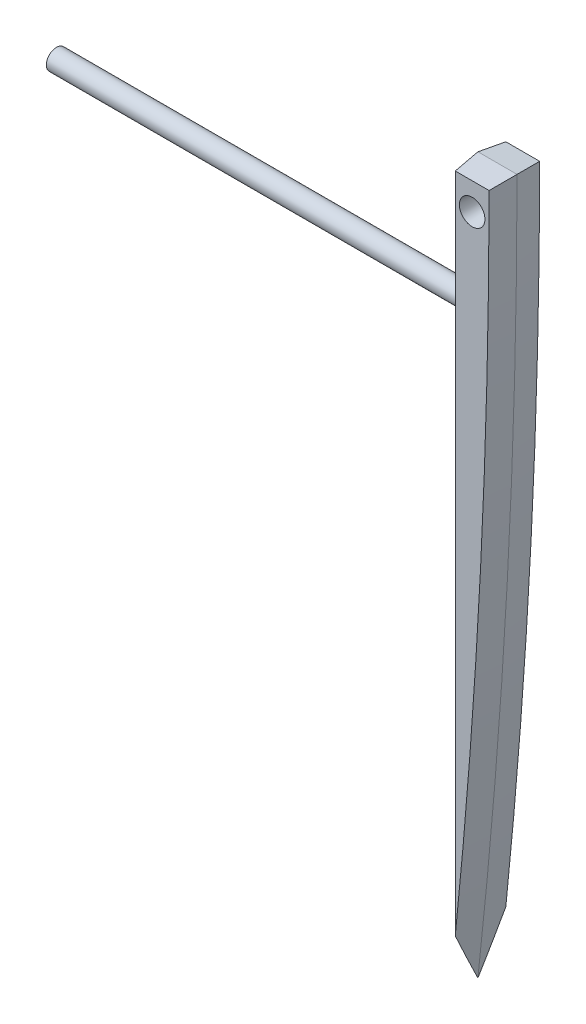
ISO-10303-21;
HEADER;
FILE_DESCRIPTION(('STEP AP214'),'2;1');
FILE_NAME('part.step','',(''),(''),'','','');
FILE_SCHEMA(('AUTOMOTIVE_DESIGN { 1 0 10303 214 1 1 1 1 }'));
ENDSEC;
DATA;
#1=APPLICATION_CONTEXT('core data for automotive mechanical design processes');
#2=APPLICATION_PROTOCOL_DEFINITION('international standard','automotive_design',2000,#1);
#3=PRODUCT_CONTEXT('',#1,'mechanical');
#4=PRODUCT('Part','Part','',(#3));
#5=PRODUCT_RELATED_PRODUCT_CATEGORY('part','',(#4));
#6=PRODUCT_DEFINITION_FORMATION('','',#4);
#7=PRODUCT_DEFINITION_CONTEXT('part definition',#1,'design');
#8=PRODUCT_DEFINITION('design','',#6,#7);
#9=PRODUCT_DEFINITION_SHAPE('','',#8);
#10=(LENGTH_UNIT() NAMED_UNIT(*) SI_UNIT(.MILLI.,.METRE.));
#11=(NAMED_UNIT(*) PLANE_ANGLE_UNIT() SI_UNIT($,.RADIAN.));
#12=(NAMED_UNIT(*) SI_UNIT($,.STERADIAN.) SOLID_ANGLE_UNIT());
#13=UNCERTAINTY_MEASURE_WITH_UNIT(LENGTH_MEASURE(1.E-05),#10,'distance_accuracy_value','');
#14=(GEOMETRIC_REPRESENTATION_CONTEXT(3) GLOBAL_UNCERTAINTY_ASSIGNED_CONTEXT((#13)) GLOBAL_UNIT_ASSIGNED_CONTEXT((#10,
#11,#12)) REPRESENTATION_CONTEXT('',''));
#15=CARTESIAN_POINT('',(0.,0.,0.));
#16=DIRECTION('',(0.,0.,1.));
#17=DIRECTION('',(1.,0.,0.));
#18=AXIS2_PLACEMENT_3D('',#15,#16,#17);
#19=CARTESIAN_POINT('',(-41.6483855846604,24.230814719516,0.));
#20=DIRECTION('',(1.,0.,0.));
#21=DIRECTION('',(0.,0.,-1.));
#22=AXIS2_PLACEMENT_3D('',#19,#20,#21);
#23=CYLINDRICAL_SURFACE('',#22,1.);
#24=CARTESIAN_POINT('',(-41.6483855846604,24.230814719516,0.));
#25=DIRECTION('',(1.,0.,0.));
#26=DIRECTION('',(0.,0.,-1.));
#27=AXIS2_PLACEMENT_3D('',#24,#25,#26);
#28=CIRCLE('',#27,1.);
#29=CARTESIAN_POINT('',(-41.6483855846604,24.230814719516,-1.));
#30=VERTEX_POINT('',#29);
#31=EDGE_CURVE('E11',#30,#30,#28,.T.);
#32=ORIENTED_EDGE('',*,*,#31,.T.);
#33=EDGE_LOOP('',(#32));
#34=FACE_BOUND('',#33,.T.);
#35=CARTESIAN_POINT('',(0.,24.230814719516,0.));
#36=DIRECTION('',(1.,0.,0.));
#37=DIRECTION('',(0.,0.,-1.));
#38=AXIS2_PLACEMENT_3D('',#35,#36,#37);
#39=CIRCLE('',#38,1.);
#40=CARTESIAN_POINT('',(0.,24.230814719516,-1.));
#41=VERTEX_POINT('',#40);
#42=EDGE_CURVE('E43',#41,#41,#39,.T.);
#43=ORIENTED_EDGE('',*,*,#42,.F.);
#44=EDGE_LOOP('',(#43));
#45=FACE_BOUND('',#44,.T.);
#46=ADVANCED_FACE('F40',(#34,#45),#23,.T.);
#47=CARTESIAN_POINT('',(-41.6483855846604,24.230814719516,0.));
#48=DIRECTION('',(1.,0.,0.));
#49=DIRECTION('',(0.,0.,-1.));
#50=AXIS2_PLACEMENT_3D('',#47,#48,#49);
#51=PLANE('',#50);
#52=ORIENTED_EDGE('',*,*,#31,.F.);
#53=EDGE_LOOP('',(#52));
#54=FACE_BOUND('',#53,.T.);
#55=ADVANCED_FACE('F55',(#54),#51,.F.);
#56=CARTESIAN_POINT('',(0.,24.230814719516,0.));
#57=DIRECTION('',(1.,0.,0.));
#58=DIRECTION('',(0.,0.,-1.));
#59=AXIS2_PLACEMENT_3D('',#56,#57,#58);
#60=PLANE('',#59);
#61=ORIENTED_EDGE('',*,*,#42,.T.);
#62=EDGE_LOOP('',(#61));
#63=FACE_BOUND('',#62,.T.);
#64=ADVANCED_FACE('F52',(#63),#60,.T.);
#65=CLOSED_SHELL('',(#46,#55,#64));
#66=MANIFOLD_SOLID_BREP('B2',#65);
#67=CARTESIAN_POINT('',(0.,37.1209387159533,0.));
#68=DIRECTION('',(-0.994521895368273,0.,-0.104528463267653));
#69=DIRECTION('',(-0.104528463267653,0.,0.994521895368273));
#70=AXIS2_PLACEMENT_3D('',#67,#68,#69);
#71=PLANE('',#70);
#72=DIRECTION('',(0.,-1.,0.));
#73=VECTOR('',#72,1.);
#74=CARTESIAN_POINT('',(0.,37.1209387159533,0.));
#75=LINE('',#74,#73);
#76=CARTESIAN_POINT('',(0.,37.1209387159533,0.));
#77=VERTEX_POINT('',#76);
#78=CARTESIAN_POINT('',(0.,-33.5856112191957,0.));
#79=VERTEX_POINT('',#78);
#80=EDGE_CURVE('E118',#77,#79,#75,.T.);
#81=ORIENTED_EDGE('',*,*,#80,.F.);
#82=DIRECTION('',(-0.103962051184498,0.103962051184498,0.989132844377854));
#83=VECTOR('',#82,1.);
#84=CARTESIAN_POINT('',(0.,37.1209387159533,0.));
#85=LINE('',#84,#83);
#86=CARTESIAN_POINT('',(0.262760588164191,36.8581781277891,-2.5));
#87=VERTEX_POINT('',#86);
#88=EDGE_CURVE('E38',#87,#77,#85,.T.);
#89=ORIENTED_EDGE('',*,*,#88,.F.);
#90=DIRECTION('',(0.,-1.,0.));
#91=VECTOR('',#90,1.);
#92=CARTESIAN_POINT('',(0.262760588164191,37.1209387159533,-2.5));
#93=LINE('',#92,#91);
#94=CARTESIAN_POINT('',(0.262760588164191,-28.6054599772317,-2.5));
#95=VERTEX_POINT('',#94);
#96=EDGE_CURVE('E146',#87,#95,#93,.T.);
#97=ORIENTED_EDGE('',*,*,#96,.T.);
#98=CARTESIAN_POINT('',(0.262760588164191,-28.6054599772317,-2.5));
#99=CARTESIAN_POINT('',(0.220241124288974,-29.4416370621499,-2.09545432429303));
#100=CARTESIAN_POINT('',(0.177084676424981,-30.2747382126037,-1.68484815076535));
#101=CARTESIAN_POINT('',(0.0894978136757759,-31.9347886264575,-0.851514817167438));
#102=CARTESIAN_POINT('',(0.0450673988183838,-32.7617378899916,-0.428787657361903));
#103=CARTESIAN_POINT('',(0.,-33.5856112191959,-3.41812238431407E-13));
#104=B_SPLINE_CURVE_WITH_KNOTS('',3,(#98,#99,#100,#101,#102,#103),.UNSPECIFIED.,.F.,.F.,(4,2,4),
(0.,2.78938289242799,5.57876572394327),.UNSPECIFIED.);
#105=EDGE_CURVE('E120',#95,#79,#104,.T.);
#106=ORIENTED_EDGE('',*,*,#105,.T.);
#107=EDGE_LOOP('',(#81,#89,#97,#106));
#108=FACE_BOUND('',#107,.T.);
#109=ADVANCED_FACE('F80',(#108),#71,.T.);
#110=CARTESIAN_POINT('',(0.,37.1209387159533,0.));
#111=DIRECTION('',(0.,0.994521895368273,-0.104528463267653));
#112=DIRECTION('',(0.,0.104528463267653,0.994521895368273));
#113=AXIS2_PLACEMENT_3D('',#110,#111,#112);
#114=PLANE('',#113);
#115=DIRECTION('',(-1.,0.,0.));
#116=VECTOR('',#115,1.);
#117=CARTESIAN_POINT('',(0.,37.1209387159533,0.));
#118=LINE('',#117,#116);
#119=CARTESIAN_POINT('',(3.86676444957845,37.1209387159533,0.));
#120=VERTEX_POINT('',#119);
#121=EDGE_CURVE('E133',#120,#77,#118,.T.);
#122=ORIENTED_EDGE('',*,*,#121,.F.);
#123=CARTESIAN_POINT('',(3.60395059812185,36.8581781277891,-2.5));
#124=CARTESIAN_POINT('',(3.64776168970888,36.9019714631654,-2.08333424656373));
#125=CARTESIAN_POINT('',(3.69156838979045,36.945764846534,-1.66666803651226));
#126=CARTESIAN_POINT('',(3.77917300694269,37.0333517092553,-0.833334703178929));
#127=CARTESIAN_POINT('',(3.82297092401336,37.0771451886082,-0.416667579897072));
#128=CARTESIAN_POINT('',(3.86676444957856,37.1209387159533,0.));
#129=B_SPLINE_CURVE_WITH_KNOTS('',3,(#123,#124,#125,#126,#127,#128),.UNSPECIFIED.,.F.,.F.,(4,2,
4),(0.,1.26373595421591,2.52747190843176),.UNSPECIFIED.);
#130=CARTESIAN_POINT('',(3.60395059812185,36.8581781277891,-2.5));
#131=VERTEX_POINT('',#130);
#132=EDGE_CURVE('E90',#131,#120,#129,.T.);
#133=ORIENTED_EDGE('',*,*,#132,.F.);
#134=DIRECTION('',(-1.,0.,0.));
#135=VECTOR('',#134,1.);
#136=CARTESIAN_POINT('',(0.,36.8581781277891,-2.5));
#137=LINE('',#136,#135);
#138=EDGE_CURVE('E136',#131,#87,#137,.T.);
#139=ORIENTED_EDGE('',*,*,#138,.T.);
#140=ORIENTED_EDGE('',*,*,#88,.T.);
#141=EDGE_LOOP('',(#122,#133,#139,#140));
#142=FACE_BOUND('',#141,.T.);
#143=ADVANCED_FACE('F132',(#142),#114,.T.);
#144=CARTESIAN_POINT('',(-644.526502896561,37.1209387159533,0.));
#145=DIRECTION('',(0.,0.,1.));
#146=DIRECTION('',(-1.,0.,0.));
#147=AXIS2_PLACEMENT_3D('',#144,#145,#146);
#148=CONICAL_SURFACE('',#147,648.39326734614,0.10471975511966);
#149=CARTESIAN_POINT('',(-644.526502896561,37.1209387159533,0.));
#150=DIRECTION('',(0.,0.,1.));
#151=DIRECTION('',(-1.,0.,0.));
#152=AXIS2_PLACEMENT_3D('',#149,#150,#151);
#153=CIRCLE('',#152,648.39326734614);
#154=EDGE_CURVE('E125',#79,#120,#153,.T.);
#155=ORIENTED_EDGE('',*,*,#154,.F.);
#156=ORIENTED_EDGE('',*,*,#105,.F.);
#157=CARTESIAN_POINT('',(-644.526502896561,37.1209387159533,-2.5));
#158=DIRECTION('',(0.,0.,-1.));
#159=DIRECTION('',(-1.,0.,0.));
#160=AXIS2_PLACEMENT_3D('',#157,#158,#159);
#161=CIRCLE('',#160,648.130506757975);
#162=EDGE_CURVE('E84',#95,#131,#161,.F.);
#163=ORIENTED_EDGE('',*,*,#162,.T.);
#164=ORIENTED_EDGE('',*,*,#132,.T.);
#165=EDGE_LOOP('',(#155,#156,#163,#164));
#166=FACE_BOUND('',#165,.T.);
#167=ADVANCED_FACE('F190',(#166),#148,.T.);
#168=CARTESIAN_POINT('',(-644.526502896561,37.1209387159533,-2.5));
#169=DIRECTION('',(0.,0.,-1.));
#170=DIRECTION('',(-1.,0.,0.));
#171=AXIS2_PLACEMENT_3D('',#168,#169,#170);
#172=PLANE('',#171);
#173=CARTESIAN_POINT('',(1.93338222478923,34.1861077292132,-2.5));
#174=DIRECTION('',(0.,0.,-1.));
#175=DIRECTION('',(-1.,0.,0.));
#176=AXIS2_PLACEMENT_3D('',#173,#174,#175);
#177=CIRCLE('',#176,1.26276058816419);
#178=CARTESIAN_POINT('',(0.670621636625034,34.1861077292132,-2.5));
#179=VERTEX_POINT('',#178);
#180=EDGE_CURVE('E126',#179,#179,#177,.F.);
#181=ORIENTED_EDGE('',*,*,#180,.T.);
#182=EDGE_LOOP('',(#181));
#183=FACE_BOUND('',#182,.T.);
#184=ORIENTED_EDGE('',*,*,#96,.F.);
#185=ORIENTED_EDGE('',*,*,#138,.F.);
#186=ORIENTED_EDGE('',*,*,#162,.F.);
#187=EDGE_LOOP('',(#184,#185,#186));
#188=FACE_BOUND('',#187,.T.);
#189=ADVANCED_FACE('F194',(#183,#188),#172,.T.);
#190=CARTESIAN_POINT('',(1.93338222478923,34.1861077292132,0.));
#191=DIRECTION('',(0.,0.,-1.));
#192=DIRECTION('',(1.,0.,0.));
#193=AXIS2_PLACEMENT_3D('',#190,#191,#192);
#194=CONICAL_SURFACE('',#193,1.,0.10471975511966);
#195=ORIENTED_EDGE('',*,*,#180,.F.);
#196=EDGE_LOOP('',(#195));
#197=FACE_BOUND('',#196,.T.);
#198=CARTESIAN_POINT('',(1.93338222478923,34.1861077292132,0.));
#199=DIRECTION('',(0.,0.,1.));
#200=DIRECTION('',(1.,0.,0.));
#201=AXIS2_PLACEMENT_3D('',#198,#199,#200);
#202=CIRCLE('',#201,1.);
#203=CARTESIAN_POINT('',(2.93338222478923,34.1861077292132,0.));
#204=VERTEX_POINT('',#203);
#205=EDGE_CURVE('E225',#204,#204,#202,.T.);
#206=ORIENTED_EDGE('',*,*,#205,.T.);
#207=EDGE_LOOP('',(#206));
#208=FACE_BOUND('',#207,.T.);
#209=ADVANCED_FACE('F82',(#197,#208),#194,.F.);
#210=CARTESIAN_POINT('',(-644.526502896561,37.1209387159533,2.5));
#211=DIRECTION('',(0.,0.,-1.));
#212=DIRECTION('',(-1.,0.,0.));
#213=AXIS2_PLACEMENT_3D('',#210,#211,#212);
#214=PLANE('',#213);
#215=DIRECTION('',(0.,1.,0.));
#216=VECTOR('',#215,1.);
#217=CARTESIAN_POINT('',(0.262760588164213,37.1209387159533,2.5));
#218=LINE('',#217,#216);
#219=CARTESIAN_POINT('',(0.262760588164191,36.8581781277891,2.5));
#220=VERTEX_POINT('',#219);
#221=CARTESIAN_POINT('',(0.262760588164191,-28.6054599772317,2.5));
#222=VERTEX_POINT('',#221);
#223=EDGE_CURVE('E150',#220,#222,#218,.F.);
#224=ORIENTED_EDGE('',*,*,#223,.T.);
#225=CARTESIAN_POINT('',(-644.526502896561,37.1209387159533,2.5));
#226=DIRECTION('',(0.,0.,-1.));
#227=DIRECTION('',(-1.,0.,0.));
#228=AXIS2_PLACEMENT_3D('',#225,#226,#227);
#229=CIRCLE('',#228,648.130506757975);
#230=CARTESIAN_POINT('',(3.60395059812185,36.8581781277891,2.5));
#231=VERTEX_POINT('',#230);
#232=EDGE_CURVE('E155',#222,#231,#229,.F.);
#233=ORIENTED_EDGE('',*,*,#232,.T.);
#234=DIRECTION('',(1.,0.,0.));
#235=VECTOR('',#234,1.);
#236=CARTESIAN_POINT('',(-644.526502896561,36.8581781277891,2.5));
#237=LINE('',#236,#235);
#238=EDGE_CURVE('E151',#231,#220,#237,.F.);
#239=ORIENTED_EDGE('',*,*,#238,.T.);
#240=EDGE_LOOP('',(#224,#233,#239));
#241=FACE_BOUND('',#240,.T.);
#242=CARTESIAN_POINT('',(1.93338222478923,34.1861077292132,2.5));
#243=DIRECTION('',(0.,0.,-1.));
#244=DIRECTION('',(-1.,0.,0.));
#245=AXIS2_PLACEMENT_3D('',#242,#243,#244);
#246=CIRCLE('',#245,1.26276058816419);
#247=CARTESIAN_POINT('',(0.670621636625034,34.1861077292132,2.5));
#248=VERTEX_POINT('',#247);
#249=EDGE_CURVE('E223',#248,#248,#246,.F.);
#250=ORIENTED_EDGE('',*,*,#249,.F.);
#251=EDGE_LOOP('',(#250));
#252=FACE_BOUND('',#251,.T.);
#253=ADVANCED_FACE('F177',(#241,#252),#214,.F.);
#254=CARTESIAN_POINT('',(0.,37.1209387159533,0.));
#255=DIRECTION('',(-0.994521895368273,0.,0.104528463267653));
#256=DIRECTION('',(0.104528463267653,0.,0.994521895368273));
#257=AXIS2_PLACEMENT_3D('',#254,#255,#256);
#258=PLANE('',#257);
#259=ORIENTED_EDGE('',*,*,#80,.T.);
#260=CARTESIAN_POINT('',(0.262760588164191,-28.6054599772317,2.5));
#261=CARTESIAN_POINT('',(0.220241124288974,-29.4416370621499,2.09545432429303));
#262=CARTESIAN_POINT('',(0.177084676424981,-30.2747382126037,1.68484815076535));
#263=CARTESIAN_POINT('',(0.0894978136757759,-31.9347886264575,0.851514817167438));
#264=CARTESIAN_POINT('',(0.0450673988183838,-32.7617378899916,0.428787657361903));
#265=CARTESIAN_POINT('',(0.,-33.5856112191959,3.41812238431407E-13));
#266=B_SPLINE_CURVE_WITH_KNOTS('',3,(#260,#261,#262,#263,#264,#265),.UNSPECIFIED.,.F.,.F.,(4,2,
4),(0.,2.78938289242799,5.57876572394327),.UNSPECIFIED.);
#267=EDGE_CURVE('E153',#222,#79,#266,.T.);
#268=ORIENTED_EDGE('',*,*,#267,.F.);
#269=ORIENTED_EDGE('',*,*,#223,.F.);
#270=DIRECTION('',(-0.103962051184498,0.103962051184498,-0.989132844377854));
#271=VECTOR('',#270,1.);
#272=CARTESIAN_POINT('',(0.,37.1209387159533,0.));
#273=LINE('',#272,#271);
#274=EDGE_CURVE('E142',#220,#77,#273,.T.);
#275=ORIENTED_EDGE('',*,*,#274,.T.);
#276=EDGE_LOOP('',(#259,#268,#269,#275));
#277=FACE_BOUND('',#276,.T.);
#278=ADVANCED_FACE('F148',(#277),#258,.T.);
#279=CARTESIAN_POINT('',(-644.526502896561,37.1209387159533,0.));
#280=DIRECTION('',(0.,0.,-1.));
#281=DIRECTION('',(-1.,0.,0.));
#282=AXIS2_PLACEMENT_3D('',#279,#280,#281);
#283=CONICAL_SURFACE('',#282,648.39326734614,0.10471975511966);
#284=ORIENTED_EDGE('',*,*,#154,.T.);
#285=CARTESIAN_POINT('',(3.60395059812185,36.8581781277891,2.5));
#286=CARTESIAN_POINT('',(3.64776168970888,36.9019714631654,2.08333424656373));
#287=CARTESIAN_POINT('',(3.69156838979045,36.945764846534,1.66666803651226));
#288=CARTESIAN_POINT('',(3.77917300694269,37.0333517092553,0.833334703178929));
#289=CARTESIAN_POINT('',(3.82297092401336,37.0771451886082,0.416667579897072));
#290=CARTESIAN_POINT('',(3.86676444957856,37.1209387159533,0.));
#291=B_SPLINE_CURVE_WITH_KNOTS('',3,(#285,#286,#287,#288,#289,#290),.UNSPECIFIED.,.F.,.F.,(4,2,
4),(0.,1.26373595421591,2.52747190843176),.UNSPECIFIED.);
#292=EDGE_CURVE('E145',#231,#120,#291,.T.);
#293=ORIENTED_EDGE('',*,*,#292,.F.);
#294=ORIENTED_EDGE('',*,*,#232,.F.);
#295=ORIENTED_EDGE('',*,*,#267,.T.);
#296=EDGE_LOOP('',(#284,#293,#294,#295));
#297=FACE_BOUND('',#296,.T.);
#298=ADVANCED_FACE('F172',(#297),#283,.T.);
#299=CARTESIAN_POINT('',(0.,37.1209387159533,0.));
#300=DIRECTION('',(0.,0.994521895368273,0.104528463267653));
#301=DIRECTION('',(0.,-0.104528463267653,0.994521895368273));
#302=AXIS2_PLACEMENT_3D('',#299,#300,#301);
#303=PLANE('',#302);
#304=ORIENTED_EDGE('',*,*,#121,.T.);
#305=ORIENTED_EDGE('',*,*,#274,.F.);
#306=ORIENTED_EDGE('',*,*,#238,.F.);
#307=ORIENTED_EDGE('',*,*,#292,.T.);
#308=EDGE_LOOP('',(#304,#305,#306,#307));
#309=FACE_BOUND('',#308,.T.);
#310=ADVANCED_FACE('F140',(#309),#303,.T.);
#311=CARTESIAN_POINT('',(1.93338222478923,34.1861077292132,0.));
#312=DIRECTION('',(0.,0.,1.));
#313=DIRECTION('',(1.,0.,0.));
#314=AXIS2_PLACEMENT_3D('',#311,#312,#313);
#315=CONICAL_SURFACE('',#314,1.,0.10471975511966);
#316=ORIENTED_EDGE('',*,*,#249,.T.);
#317=EDGE_LOOP('',(#316));
#318=FACE_BOUND('',#317,.T.);
#319=ORIENTED_EDGE('',*,*,#205,.F.);
#320=EDGE_LOOP('',(#319));
#321=FACE_BOUND('',#320,.T.);
#322=ADVANCED_FACE('F229',(#318,#321),#315,.F.);
#323=CLOSED_SHELL('',(#109,#143,#167,#189,#209,#253,#278,#298,#310,#322));
#324=MANIFOLD_SOLID_BREP('B6',#323);
#325=ADVANCED_BREP_SHAPE_REPRESENTATION('',(#18,#66,#324),#14);
#326=SHAPE_DEFINITION_REPRESENTATION(#9,#325);
ENDSEC;
END-ISO-10303-21;
